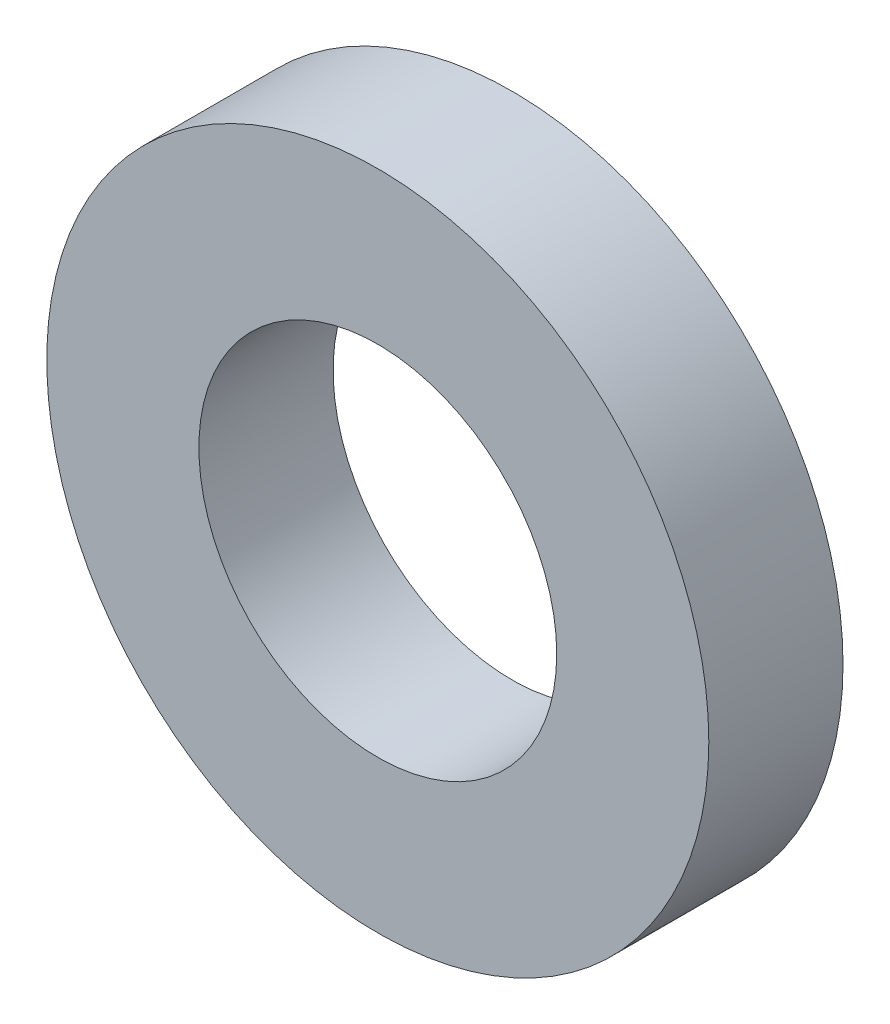
ISO-10303-21;
HEADER;
FILE_DESCRIPTION(('STEP AP214'),'2;1');
FILE_NAME('part.step','',(''),(''),'','','');
FILE_SCHEMA(('AUTOMOTIVE_DESIGN { 1 0 10303 214 1 1 1 1 }'));
ENDSEC;
DATA;
#1=APPLICATION_CONTEXT('core data for automotive mechanical design processes');
#2=APPLICATION_PROTOCOL_DEFINITION('international standard','automotive_design',2000,#1);
#3=PRODUCT_CONTEXT('',#1,'mechanical');
#4=PRODUCT('Part','Part','',(#3));
#5=PRODUCT_RELATED_PRODUCT_CATEGORY('part','',(#4));
#6=PRODUCT_DEFINITION_FORMATION('','',#4);
#7=PRODUCT_DEFINITION_CONTEXT('part definition',#1,'design');
#8=PRODUCT_DEFINITION('design','',#6,#7);
#9=PRODUCT_DEFINITION_SHAPE('','',#8);
#10=(LENGTH_UNIT() NAMED_UNIT(*) SI_UNIT(.MILLI.,.METRE.));
#11=(NAMED_UNIT(*) PLANE_ANGLE_UNIT() SI_UNIT($,.RADIAN.));
#12=(NAMED_UNIT(*) SI_UNIT($,.STERADIAN.) SOLID_ANGLE_UNIT());
#13=UNCERTAINTY_MEASURE_WITH_UNIT(LENGTH_MEASURE(1.E-05),#10,'distance_accuracy_value','');
#14=(GEOMETRIC_REPRESENTATION_CONTEXT(3) GLOBAL_UNCERTAINTY_ASSIGNED_CONTEXT((#13)) GLOBAL_UNIT_ASSIGNED_CONTEXT((#10,
#11,#12)) REPRESENTATION_CONTEXT('',''));
#15=CARTESIAN_POINT('',(0.,0.,0.));
#16=DIRECTION('',(0.,0.,1.));
#17=DIRECTION('',(1.,0.,0.));
#18=AXIS2_PLACEMENT_3D('',#15,#16,#17);
#19=CARTESIAN_POINT('',(0.,0.,3.));
#20=DIRECTION('',(0.,0.,1.));
#21=DIRECTION('',(1.,0.,0.));
#22=AXIS2_PLACEMENT_3D('',#19,#20,#21);
#23=PLANE('',#22);
#24=CARTESIAN_POINT('',(0.,0.,3.));
#25=DIRECTION('',(0.,0.,1.));
#26=DIRECTION('',(1.,0.,0.));
#27=AXIS2_PLACEMENT_3D('',#24,#25,#26);
#28=CIRCLE('',#27,7.4);
#29=CARTESIAN_POINT('',(7.4,0.,3.));
#30=VERTEX_POINT('',#29);
#31=EDGE_CURVE('E10',#30,#30,#28,.T.);
#32=ORIENTED_EDGE('',*,*,#31,.T.);
#33=EDGE_LOOP('',(#32));
#34=FACE_BOUND('',#33,.T.);
#35=CARTESIAN_POINT('',(0.,0.,3.));
#36=DIRECTION('',(0.,0.,1.));
#37=DIRECTION('',(1.,0.,0.));
#38=AXIS2_PLACEMENT_3D('',#35,#36,#37);
#39=CIRCLE('',#38,4.);
#40=CARTESIAN_POINT('',(4.,0.,3.));
#41=VERTEX_POINT('',#40);
#42=EDGE_CURVE('E50',#41,#41,#39,.T.);
#43=ORIENTED_EDGE('',*,*,#42,.F.);
#44=EDGE_LOOP('',(#43));
#45=FACE_BOUND('',#44,.T.);
#46=ADVANCED_FACE('F37',(#34,#45),#23,.T.);
#47=CARTESIAN_POINT('',(0.,0.,0.));
#48=DIRECTION('',(0.,0.,1.));
#49=DIRECTION('',(1.,0.,0.));
#50=AXIS2_PLACEMENT_3D('',#47,#48,#49);
#51=PLANE('',#50);
#52=CARTESIAN_POINT('',(0.,0.,0.));
#53=DIRECTION('',(0.,0.,1.));
#54=DIRECTION('',(1.,0.,0.));
#55=AXIS2_PLACEMENT_3D('',#52,#53,#54);
#56=CIRCLE('',#55,7.4);
#57=CARTESIAN_POINT('',(7.4,0.,0.));
#58=VERTEX_POINT('',#57);
#59=EDGE_CURVE('E41',#58,#58,#56,.T.);
#60=ORIENTED_EDGE('',*,*,#59,.F.);
#61=EDGE_LOOP('',(#60));
#62=FACE_BOUND('',#61,.T.);
#63=CARTESIAN_POINT('',(0.,0.,0.));
#64=DIRECTION('',(0.,0.,1.));
#65=DIRECTION('',(1.,0.,0.));
#66=AXIS2_PLACEMENT_3D('',#63,#64,#65);
#67=CIRCLE('',#66,4.);
#68=CARTESIAN_POINT('',(4.,0.,0.));
#69=VERTEX_POINT('',#68);
#70=EDGE_CURVE('E52',#69,#69,#67,.T.);
#71=ORIENTED_EDGE('',*,*,#70,.T.);
#72=EDGE_LOOP('',(#71));
#73=FACE_BOUND('',#72,.T.);
#74=ADVANCED_FACE('F64',(#62,#73),#51,.F.);
#75=CARTESIAN_POINT('',(0.,0.,3.));
#76=DIRECTION('',(0.,0.,-1.));
#77=DIRECTION('',(-1.,0.,0.));
#78=AXIS2_PLACEMENT_3D('',#75,#76,#77);
#79=CYLINDRICAL_SURFACE('',#78,7.4);
#80=ORIENTED_EDGE('',*,*,#31,.F.);
#81=EDGE_LOOP('',(#80));
#82=FACE_BOUND('',#81,.T.);
#83=ORIENTED_EDGE('',*,*,#59,.T.);
#84=EDGE_LOOP('',(#83));
#85=FACE_BOUND('',#84,.T.);
#86=ADVANCED_FACE('F39',(#82,#85),#79,.T.);
#87=CARTESIAN_POINT('',(0.,0.,3.));
#88=DIRECTION('',(0.,0.,-1.));
#89=DIRECTION('',(-1.,0.,0.));
#90=AXIS2_PLACEMENT_3D('',#87,#88,#89);
#91=CYLINDRICAL_SURFACE('',#90,4.);
#92=ORIENTED_EDGE('',*,*,#42,.T.);
#93=EDGE_LOOP('',(#92));
#94=FACE_BOUND('',#93,.T.);
#95=ORIENTED_EDGE('',*,*,#70,.F.);
#96=EDGE_LOOP('',(#95));
#97=FACE_BOUND('',#96,.T.);
#98=ADVANCED_FACE('F60',(#94,#97),#91,.F.);
#99=CLOSED_SHELL('',(#46,#74,#86,#98));
#100=MANIFOLD_SOLID_BREP('B2',#99);
#101=ADVANCED_BREP_SHAPE_REPRESENTATION('',(#18,#100),#14);
#102=SHAPE_DEFINITION_REPRESENTATION(#9,#101);
ENDSEC;
END-ISO-10303-21;
